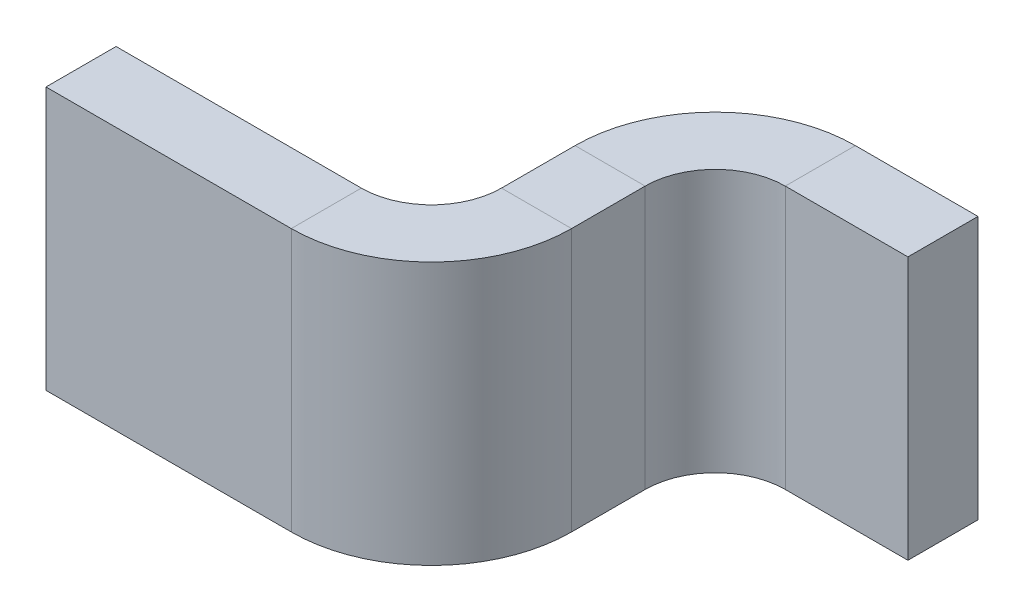
ISO-10303-21;
HEADER;
FILE_DESCRIPTION(('STEP AP214'),'2;1');
FILE_NAME('part.step','',(''),(''),'','','');
FILE_SCHEMA(('AUTOMOTIVE_DESIGN { 1 0 10303 214 1 1 1 1 }'));
ENDSEC;
DATA;
#1=APPLICATION_CONTEXT('core data for automotive mechanical design processes');
#2=APPLICATION_PROTOCOL_DEFINITION('international standard','automotive_design',2000,#1);
#3=PRODUCT_CONTEXT('',#1,'mechanical');
#4=PRODUCT('Part','Part','',(#3));
#5=PRODUCT_RELATED_PRODUCT_CATEGORY('part','',(#4));
#6=PRODUCT_DEFINITION_FORMATION('','',#4);
#7=PRODUCT_DEFINITION_CONTEXT('part definition',#1,'design');
#8=PRODUCT_DEFINITION('design','',#6,#7);
#9=PRODUCT_DEFINITION_SHAPE('','',#8);
#10=(LENGTH_UNIT() NAMED_UNIT(*) SI_UNIT(.MILLI.,.METRE.));
#11=(NAMED_UNIT(*) PLANE_ANGLE_UNIT() SI_UNIT($,.RADIAN.));
#12=(NAMED_UNIT(*) SI_UNIT($,.STERADIAN.) SOLID_ANGLE_UNIT());
#13=UNCERTAINTY_MEASURE_WITH_UNIT(LENGTH_MEASURE(1.E-05),#10,'distance_accuracy_value','');
#14=(GEOMETRIC_REPRESENTATION_CONTEXT(3) GLOBAL_UNCERTAINTY_ASSIGNED_CONTEXT((#13)) GLOBAL_UNIT_ASSIGNED_CONTEXT((#10,
#11,#12)) REPRESENTATION_CONTEXT('',''));
#15=CARTESIAN_POINT('',(0.,0.,0.));
#16=DIRECTION('',(0.,0.,1.));
#17=DIRECTION('',(1.,0.,0.));
#18=AXIS2_PLACEMENT_3D('',#15,#16,#17);
#19=CARTESIAN_POINT('',(0.,-0.375,0.81));
#20=DIRECTION('',(-1.,0.,0.));
#21=DIRECTION('',(0.,0.,-1.));
#22=AXIS2_PLACEMENT_3D('',#19,#20,#21);
#23=PLANE('',#22);
#24=DIRECTION('',(0.,0.,1.));
#25=VECTOR('',#24,1.);
#26=CARTESIAN_POINT('',(0.,-0.375,1.01));
#27=LINE('',#26,#25);
#28=CARTESIAN_POINT('',(0.,-0.375,0.81));
#29=VERTEX_POINT('',#28);
#30=CARTESIAN_POINT('',(0.,-0.375,1.01));
#31=VERTEX_POINT('',#30);
#32=EDGE_CURVE('E11',#29,#31,#27,.T.);
#33=ORIENTED_EDGE('',*,*,#32,.T.);
#34=DIRECTION('',(0.,1.,0.));
#35=VECTOR('',#34,1.);
#36=CARTESIAN_POINT('',(0.,0.375,1.01));
#37=LINE('',#36,#35);
#38=CARTESIAN_POINT('',(0.,0.375,1.01));
#39=VERTEX_POINT('',#38);
#40=EDGE_CURVE('E24',#31,#39,#37,.T.);
#41=ORIENTED_EDGE('',*,*,#40,.T.);
#42=DIRECTION('',(0.,0.,-1.));
#43=VECTOR('',#42,1.);
#44=CARTESIAN_POINT('',(0.,0.375,0.81));
#45=LINE('',#44,#43);
#46=CARTESIAN_POINT('',(0.,0.375,0.81));
#47=VERTEX_POINT('',#46);
#48=EDGE_CURVE('E217',#39,#47,#45,.T.);
#49=ORIENTED_EDGE('',*,*,#48,.T.);
#50=DIRECTION('',(0.,-1.,0.));
#51=VECTOR('',#50,1.);
#52=CARTESIAN_POINT('',(0.,-0.375,0.81));
#53=LINE('',#52,#51);
#54=EDGE_CURVE('E36',#47,#29,#53,.T.);
#55=ORIENTED_EDGE('',*,*,#54,.T.);
#56=EDGE_LOOP('',(#33,#41,#49,#55));
#57=FACE_BOUND('',#56,.T.);
#58=ADVANCED_FACE('F17',(#57),#23,.T.);
#59=CARTESIAN_POINT('',(0.,-0.375,0.81));
#60=DIRECTION('',(0.,0.,1.));
#61=DIRECTION('',(0.,-1.,0.));
#62=AXIS2_PLACEMENT_3D('',#59,#60,#61);
#63=PLANE('',#62);
#64=DIRECTION('',(0.,-1.,0.));
#65=VECTOR('',#64,1.);
#66=CARTESIAN_POINT('',(0.7,-0.375,0.81));
#67=LINE('',#66,#65);
#68=CARTESIAN_POINT('',(0.7,0.375,0.81));
#69=VERTEX_POINT('',#68);
#70=CARTESIAN_POINT('',(0.7,-0.375,0.81));
#71=VERTEX_POINT('',#70);
#72=EDGE_CURVE('E213',#69,#71,#67,.T.);
#73=ORIENTED_EDGE('',*,*,#72,.T.);
#74=DIRECTION('',(1.,0.,0.));
#75=VECTOR('',#74,1.);
#76=CARTESIAN_POINT('',(0.,-0.375,0.81));
#77=LINE('',#76,#75);
#78=EDGE_CURVE('E211',#29,#71,#77,.T.);
#79=ORIENTED_EDGE('',*,*,#78,.F.);
#80=ORIENTED_EDGE('',*,*,#54,.F.);
#81=DIRECTION('',(1.,0.,0.));
#82=VECTOR('',#81,1.);
#83=CARTESIAN_POINT('',(0.,0.375,0.81));
#84=LINE('',#83,#82);
#85=EDGE_CURVE('E209',#47,#69,#84,.T.);
#86=ORIENTED_EDGE('',*,*,#85,.T.);
#87=EDGE_LOOP('',(#73,#79,#80,#86));
#88=FACE_BOUND('',#87,.T.);
#89=ADVANCED_FACE('F228',(#88),#63,.F.);
#90=CARTESIAN_POINT('',(0.7,-0.375,0.61));
#91=DIRECTION('',(0.,1.,0.));
#92=DIRECTION('',(0.,0.,-1.));
#93=AXIS2_PLACEMENT_3D('',#90,#91,#92);
#94=CYLINDRICAL_SURFACE('',#93,0.2);
#95=DIRECTION('',(0.,1.,0.));
#96=VECTOR('',#95,1.);
#97=CARTESIAN_POINT('',(0.9,-0.375,0.61));
#98=LINE('',#97,#96);
#99=CARTESIAN_POINT('',(0.9,-0.375,0.61));
#100=VERTEX_POINT('',#99);
#101=CARTESIAN_POINT('',(0.9,0.375,0.61));
#102=VERTEX_POINT('',#101);
#103=EDGE_CURVE('E206',#100,#102,#98,.T.);
#104=ORIENTED_EDGE('',*,*,#103,.F.);
#105=CARTESIAN_POINT('',(0.7,-0.375,0.61));
#106=DIRECTION('',(0.,1.,0.));
#107=DIRECTION('',(0.,0.,-1.));
#108=AXIS2_PLACEMENT_3D('',#105,#106,#107);
#109=CIRCLE('',#108,0.2);
#110=EDGE_CURVE('E204',#71,#100,#109,.T.);
#111=ORIENTED_EDGE('',*,*,#110,.F.);
#112=ORIENTED_EDGE('',*,*,#72,.F.);
#113=CARTESIAN_POINT('',(0.7,0.375,0.61));
#114=DIRECTION('',(0.,1.,0.));
#115=DIRECTION('',(0.,0.,-1.));
#116=AXIS2_PLACEMENT_3D('',#113,#114,#115);
#117=CIRCLE('',#116,0.2);
#118=EDGE_CURVE('E202',#69,#102,#117,.T.);
#119=ORIENTED_EDGE('',*,*,#118,.T.);
#120=EDGE_LOOP('',(#104,#111,#112,#119));
#121=FACE_BOUND('',#120,.T.);
#122=ADVANCED_FACE('F234',(#121),#94,.F.);
#123=CARTESIAN_POINT('',(0.9,-0.375,0.61));
#124=DIRECTION('',(1.,0.,0.));
#125=DIRECTION('',(0.,-1.,0.));
#126=AXIS2_PLACEMENT_3D('',#123,#124,#125);
#127=PLANE('',#126);
#128=DIRECTION('',(0.,-1.,0.));
#129=VECTOR('',#128,1.);
#130=CARTESIAN_POINT('',(0.9,-0.375,0.4));
#131=LINE('',#130,#129);
#132=CARTESIAN_POINT('',(0.9,0.375,0.4));
#133=VERTEX_POINT('',#132);
#134=CARTESIAN_POINT('',(0.9,-0.375,0.4));
#135=VERTEX_POINT('',#134);
#136=EDGE_CURVE('E199',#133,#135,#131,.T.);
#137=ORIENTED_EDGE('',*,*,#136,.T.);
#138=DIRECTION('',(0.,0.,-1.));
#139=VECTOR('',#138,1.);
#140=CARTESIAN_POINT('',(0.9,-0.375,0.61));
#141=LINE('',#140,#139);
#142=EDGE_CURVE('E197',#100,#135,#141,.T.);
#143=ORIENTED_EDGE('',*,*,#142,.F.);
#144=ORIENTED_EDGE('',*,*,#103,.T.);
#145=DIRECTION('',(0.,0.,-1.));
#146=VECTOR('',#145,1.);
#147=CARTESIAN_POINT('',(0.9,0.375,0.61));
#148=LINE('',#147,#146);
#149=EDGE_CURVE('E195',#102,#133,#148,.T.);
#150=ORIENTED_EDGE('',*,*,#149,.T.);
#151=EDGE_LOOP('',(#137,#143,#144,#150));
#152=FACE_BOUND('',#151,.T.);
#153=ADVANCED_FACE('F246',(#152),#127,.F.);
#154=CARTESIAN_POINT('',(1.3,-0.375,0.4));
#155=DIRECTION('',(0.,-1.,0.));
#156=DIRECTION('',(0.,0.,-1.));
#157=AXIS2_PLACEMENT_3D('',#154,#155,#156);
#158=CYLINDRICAL_SURFACE('',#157,0.4);
#159=CARTESIAN_POINT('',(1.3,0.375,0.4));
#160=DIRECTION('',(0.,-1.,0.));
#161=DIRECTION('',(0.,0.,-1.));
#162=AXIS2_PLACEMENT_3D('',#159,#160,#161);
#163=CIRCLE('',#162,0.4);
#164=CARTESIAN_POINT('',(1.3,0.375,0.));
#165=VERTEX_POINT('',#164);
#166=EDGE_CURVE('E193',#133,#165,#163,.T.);
#167=ORIENTED_EDGE('',*,*,#166,.T.);
#168=DIRECTION('',(0.,-1.,0.));
#169=VECTOR('',#168,1.);
#170=CARTESIAN_POINT('',(1.3,-0.375,0.));
#171=LINE('',#170,#169);
#172=CARTESIAN_POINT('',(1.3,-0.375,0.));
#173=VERTEX_POINT('',#172);
#174=EDGE_CURVE('E191',#165,#173,#171,.T.);
#175=ORIENTED_EDGE('',*,*,#174,.T.);
#176=CARTESIAN_POINT('',(1.3,-0.375,0.4));
#177=DIRECTION('',(0.,-1.,0.));
#178=DIRECTION('',(0.,0.,-1.));
#179=AXIS2_PLACEMENT_3D('',#176,#177,#178);
#180=CIRCLE('',#179,0.4);
#181=EDGE_CURVE('E188',#135,#173,#180,.T.);
#182=ORIENTED_EDGE('',*,*,#181,.F.);
#183=ORIENTED_EDGE('',*,*,#136,.F.);
#184=EDGE_LOOP('',(#167,#175,#182,#183));
#185=FACE_BOUND('',#184,.T.);
#186=ADVANCED_FACE('F251',(#185),#158,.T.);
#187=CARTESIAN_POINT('',(1.3,-0.375,0.));
#188=DIRECTION('',(0.,0.,1.));
#189=DIRECTION('',(0.,-1.,0.));
#190=AXIS2_PLACEMENT_3D('',#187,#188,#189);
#191=PLANE('',#190);
#192=DIRECTION('',(0.,-1.,0.));
#193=VECTOR('',#192,1.);
#194=CARTESIAN_POINT('',(1.65,-0.375,0.));
#195=LINE('',#194,#193);
#196=CARTESIAN_POINT('',(1.65,0.375,0.));
#197=VERTEX_POINT('',#196);
#198=CARTESIAN_POINT('',(1.65,-0.375,0.));
#199=VERTEX_POINT('',#198);
#200=EDGE_CURVE('E130',#197,#199,#195,.T.);
#201=ORIENTED_EDGE('',*,*,#200,.T.);
#202=DIRECTION('',(1.,0.,0.));
#203=VECTOR('',#202,1.);
#204=CARTESIAN_POINT('',(1.3,-0.375,0.));
#205=LINE('',#204,#203);
#206=EDGE_CURVE('E185',#173,#199,#205,.T.);
#207=ORIENTED_EDGE('',*,*,#206,.F.);
#208=ORIENTED_EDGE('',*,*,#174,.F.);
#209=DIRECTION('',(1.,0.,0.));
#210=VECTOR('',#209,1.);
#211=CARTESIAN_POINT('',(1.3,0.375,0.));
#212=LINE('',#211,#210);
#213=EDGE_CURVE('E183',#165,#197,#212,.T.);
#214=ORIENTED_EDGE('',*,*,#213,.T.);
#215=EDGE_LOOP('',(#201,#207,#208,#214));
#216=FACE_BOUND('',#215,.T.);
#217=ADVANCED_FACE('F268',(#216),#191,.F.);
#218=CARTESIAN_POINT('',(0.,-0.375,1.01));
#219=DIRECTION('',(0.,1.,0.));
#220=DIRECTION('',(0.,0.,1.));
#221=AXIS2_PLACEMENT_3D('',#218,#219,#220);
#222=PLANE('',#221);
#223=DIRECTION('',(0.,0.,1.));
#224=VECTOR('',#223,1.);
#225=CARTESIAN_POINT('',(0.7,-0.375,1.01));
#226=LINE('',#225,#224);
#227=CARTESIAN_POINT('',(0.7,-0.375,1.01));
#228=VERTEX_POINT('',#227);
#229=EDGE_CURVE('E180',#71,#228,#226,.T.);
#230=ORIENTED_EDGE('',*,*,#229,.T.);
#231=DIRECTION('',(1.,0.,0.));
#232=VECTOR('',#231,1.);
#233=CARTESIAN_POINT('',(0.,-0.375,1.01));
#234=LINE('',#233,#232);
#235=EDGE_CURVE('E178',#31,#228,#234,.T.);
#236=ORIENTED_EDGE('',*,*,#235,.F.);
#237=ORIENTED_EDGE('',*,*,#32,.F.);
#238=ORIENTED_EDGE('',*,*,#78,.T.);
#239=EDGE_LOOP('',(#230,#236,#237,#238));
#240=FACE_BOUND('',#239,.T.);
#241=ADVANCED_FACE('F306',(#240),#222,.F.);
#242=CARTESIAN_POINT('',(0.912132034356,-0.375,0.822132034356));
#243=DIRECTION('',(0.,-1.,0.));
#244=DIRECTION('',(0.707106781186548,0.,-0.707106781186548));
#245=AXIS2_PLACEMENT_3D('',#242,#243,#244);
#246=PLANE('',#245);
#247=ORIENTED_EDGE('',*,*,#110,.T.);
#248=DIRECTION('',(1.,0.,0.));
#249=VECTOR('',#248,1.);
#250=CARTESIAN_POINT('',(1.1,-0.375,0.61));
#251=LINE('',#250,#249);
#252=CARTESIAN_POINT('',(1.1,-0.375,0.61));
#253=VERTEX_POINT('',#252);
#254=EDGE_CURVE('E176',#100,#253,#251,.T.);
#255=ORIENTED_EDGE('',*,*,#254,.T.);
#256=CARTESIAN_POINT('',(0.7,-0.375,0.61));
#257=DIRECTION('',(0.,1.,0.));
#258=DIRECTION('',(0.,0.,-1.));
#259=AXIS2_PLACEMENT_3D('',#256,#257,#258);
#260=CIRCLE('',#259,0.4);
#261=EDGE_CURVE('E173',#228,#253,#260,.T.);
#262=ORIENTED_EDGE('',*,*,#261,.F.);
#263=ORIENTED_EDGE('',*,*,#229,.F.);
#264=EDGE_LOOP('',(#247,#255,#262,#263));
#265=FACE_BOUND('',#264,.T.);
#266=ADVANCED_FACE('F277',(#265),#246,.T.);
#267=CARTESIAN_POINT('',(1.1,-0.375,0.61));
#268=DIRECTION('',(0.,1.,0.));
#269=DIRECTION('',(1.,0.,0.));
#270=AXIS2_PLACEMENT_3D('',#267,#268,#269);
#271=PLANE('',#270);
#272=DIRECTION('',(1.,0.,0.));
#273=VECTOR('',#272,1.);
#274=CARTESIAN_POINT('',(1.1,-0.375,0.4));
#275=LINE('',#274,#273);
#276=CARTESIAN_POINT('',(1.1,-0.375,0.4));
#277=VERTEX_POINT('',#276);
#278=EDGE_CURVE('E170',#135,#277,#275,.T.);
#279=ORIENTED_EDGE('',*,*,#278,.T.);
#280=DIRECTION('',(0.,0.,-1.));
#281=VECTOR('',#280,1.);
#282=CARTESIAN_POINT('',(1.1,-0.375,0.61));
#283=LINE('',#282,#281);
#284=EDGE_CURVE('E168',#253,#277,#283,.T.);
#285=ORIENTED_EDGE('',*,*,#284,.F.);
#286=ORIENTED_EDGE('',*,*,#254,.F.);
#287=ORIENTED_EDGE('',*,*,#142,.T.);
#288=EDGE_LOOP('',(#279,#285,#286,#287));
#289=FACE_BOUND('',#288,.T.);
#290=ADVANCED_FACE('F272',(#289),#271,.F.);
#291=CARTESIAN_POINT('',(1.087867965644,-0.375,0.187867965644));
#292=DIRECTION('',(0.,-1.,0.));
#293=DIRECTION('',(0.707106781186548,0.,-0.707106781186548));
#294=AXIS2_PLACEMENT_3D('',#291,#292,#293);
#295=PLANE('',#294);
#296=ORIENTED_EDGE('',*,*,#181,.T.);
#297=DIRECTION('',(0.,0.,1.));
#298=VECTOR('',#297,1.);
#299=CARTESIAN_POINT('',(1.3,-0.375,0.2));
#300=LINE('',#299,#298);
#301=CARTESIAN_POINT('',(1.3,-0.375,0.2));
#302=VERTEX_POINT('',#301);
#303=EDGE_CURVE('E166',#173,#302,#300,.T.);
#304=ORIENTED_EDGE('',*,*,#303,.T.);
#305=CARTESIAN_POINT('',(1.3,-0.375,0.4));
#306=DIRECTION('',(0.,-1.,0.));
#307=DIRECTION('',(0.,0.,-1.));
#308=AXIS2_PLACEMENT_3D('',#305,#306,#307);
#309=CIRCLE('',#308,0.2);
#310=EDGE_CURVE('E163',#277,#302,#309,.T.);
#311=ORIENTED_EDGE('',*,*,#310,.F.);
#312=ORIENTED_EDGE('',*,*,#278,.F.);
#313=EDGE_LOOP('',(#296,#304,#311,#312));
#314=FACE_BOUND('',#313,.T.);
#315=ADVANCED_FACE('F269',(#314),#295,.T.);
#316=CARTESIAN_POINT('',(1.3,-0.375,0.2));
#317=DIRECTION('',(0.,1.,0.));
#318=DIRECTION('',(0.,0.,1.));
#319=AXIS2_PLACEMENT_3D('',#316,#317,#318);
#320=PLANE('',#319);
#321=DIRECTION('',(0.,0.,1.));
#322=VECTOR('',#321,1.);
#323=CARTESIAN_POINT('',(1.65,-0.375,0.2));
#324=LINE('',#323,#322);
#325=CARTESIAN_POINT('',(1.65,-0.375,0.2));
#326=VERTEX_POINT('',#325);
#327=EDGE_CURVE('E161',#199,#326,#324,.T.);
#328=ORIENTED_EDGE('',*,*,#327,.T.);
#329=DIRECTION('',(1.,0.,0.));
#330=VECTOR('',#329,1.);
#331=CARTESIAN_POINT('',(1.3,-0.375,0.2));
#332=LINE('',#331,#330);
#333=EDGE_CURVE('E121',#302,#326,#332,.T.);
#334=ORIENTED_EDGE('',*,*,#333,.F.);
#335=ORIENTED_EDGE('',*,*,#303,.F.);
#336=ORIENTED_EDGE('',*,*,#206,.T.);
#337=EDGE_LOOP('',(#328,#334,#335,#336));
#338=FACE_BOUND('',#337,.T.);
#339=ADVANCED_FACE('F265',(#338),#320,.F.);
#340=CARTESIAN_POINT('',(0.,0.375,1.01));
#341=DIRECTION('',(0.,0.,-1.));
#342=DIRECTION('',(0.,1.,0.));
#343=AXIS2_PLACEMENT_3D('',#340,#341,#342);
#344=PLANE('',#343);
#345=DIRECTION('',(0.,1.,0.));
#346=VECTOR('',#345,1.);
#347=CARTESIAN_POINT('',(0.7,0.375,1.01));
#348=LINE('',#347,#346);
#349=CARTESIAN_POINT('',(0.7,0.375,1.01));
#350=VERTEX_POINT('',#349);
#351=EDGE_CURVE('E157',#228,#350,#348,.T.);
#352=ORIENTED_EDGE('',*,*,#351,.T.);
#353=DIRECTION('',(1.,0.,0.));
#354=VECTOR('',#353,1.);
#355=CARTESIAN_POINT('',(0.,0.375,1.01));
#356=LINE('',#355,#354);
#357=EDGE_CURVE('E155',#39,#350,#356,.T.);
#358=ORIENTED_EDGE('',*,*,#357,.F.);
#359=ORIENTED_EDGE('',*,*,#40,.F.);
#360=ORIENTED_EDGE('',*,*,#235,.T.);
#361=EDGE_LOOP('',(#352,#358,#359,#360));
#362=FACE_BOUND('',#361,.T.);
#363=ADVANCED_FACE('F220',(#362),#344,.F.);
#364=CARTESIAN_POINT('',(0.7,0.375,0.61));
#365=DIRECTION('',(0.,1.,0.));
#366=DIRECTION('',(0.,0.,-1.));
#367=AXIS2_PLACEMENT_3D('',#364,#365,#366);
#368=CYLINDRICAL_SURFACE('',#367,0.4);
#369=ORIENTED_EDGE('',*,*,#261,.T.);
#370=DIRECTION('',(0.,1.,0.));
#371=VECTOR('',#370,1.);
#372=CARTESIAN_POINT('',(1.1,0.375,0.61));
#373=LINE('',#372,#371);
#374=CARTESIAN_POINT('',(1.1,0.375,0.61));
#375=VERTEX_POINT('',#374);
#376=EDGE_CURVE('E153',#253,#375,#373,.T.);
#377=ORIENTED_EDGE('',*,*,#376,.T.);
#378=CARTESIAN_POINT('',(0.7,0.375,0.61));
#379=DIRECTION('',(0.,1.,0.));
#380=DIRECTION('',(0.,0.,-1.));
#381=AXIS2_PLACEMENT_3D('',#378,#379,#380);
#382=CIRCLE('',#381,0.4);
#383=EDGE_CURVE('E150',#350,#375,#382,.T.);
#384=ORIENTED_EDGE('',*,*,#383,.F.);
#385=ORIENTED_EDGE('',*,*,#351,.F.);
#386=EDGE_LOOP('',(#369,#377,#384,#385));
#387=FACE_BOUND('',#386,.T.);
#388=ADVANCED_FACE('F279',(#387),#368,.T.);
#389=CARTESIAN_POINT('',(1.1,0.375,0.61));
#390=DIRECTION('',(-1.,0.,0.));
#391=DIRECTION('',(0.,1.,0.));
#392=AXIS2_PLACEMENT_3D('',#389,#390,#391);
#393=PLANE('',#392);
#394=DIRECTION('',(0.,1.,0.));
#395=VECTOR('',#394,1.);
#396=CARTESIAN_POINT('',(1.1,0.375,0.4));
#397=LINE('',#396,#395);
#398=CARTESIAN_POINT('',(1.1,0.375,0.4));
#399=VERTEX_POINT('',#398);
#400=EDGE_CURVE('E147',#277,#399,#397,.T.);
#401=ORIENTED_EDGE('',*,*,#400,.T.);
#402=DIRECTION('',(0.,0.,-1.));
#403=VECTOR('',#402,1.);
#404=CARTESIAN_POINT('',(1.1,0.375,0.61));
#405=LINE('',#404,#403);
#406=EDGE_CURVE('E145',#375,#399,#405,.T.);
#407=ORIENTED_EDGE('',*,*,#406,.F.);
#408=ORIENTED_EDGE('',*,*,#376,.F.);
#409=ORIENTED_EDGE('',*,*,#284,.T.);
#410=EDGE_LOOP('',(#401,#407,#408,#409));
#411=FACE_BOUND('',#410,.T.);
#412=ADVANCED_FACE('F281',(#411),#393,.F.);
#413=CARTESIAN_POINT('',(1.3,0.375,0.4));
#414=DIRECTION('',(0.,-1.,0.));
#415=DIRECTION('',(0.,0.,-1.));
#416=AXIS2_PLACEMENT_3D('',#413,#414,#415);
#417=CYLINDRICAL_SURFACE('',#416,0.2);
#418=DIRECTION('',(0.,-1.,0.));
#419=VECTOR('',#418,1.);
#420=CARTESIAN_POINT('',(1.3,0.375,0.2));
#421=LINE('',#420,#419);
#422=CARTESIAN_POINT('',(1.3,0.375,0.2));
#423=VERTEX_POINT('',#422);
#424=EDGE_CURVE('E143',#423,#302,#421,.T.);
#425=ORIENTED_EDGE('',*,*,#424,.F.);
#426=CARTESIAN_POINT('',(1.3,0.375,0.4));
#427=DIRECTION('',(0.,-1.,0.));
#428=DIRECTION('',(0.,0.,-1.));
#429=AXIS2_PLACEMENT_3D('',#426,#427,#428);
#430=CIRCLE('',#429,0.2);
#431=EDGE_CURVE('E125',#399,#423,#430,.T.);
#432=ORIENTED_EDGE('',*,*,#431,.F.);
#433=ORIENTED_EDGE('',*,*,#400,.F.);
#434=ORIENTED_EDGE('',*,*,#310,.T.);
#435=EDGE_LOOP('',(#425,#432,#433,#434));
#436=FACE_BOUND('',#435,.T.);
#437=ADVANCED_FACE('F260',(#436),#417,.F.);
#438=CARTESIAN_POINT('',(1.3,0.375,0.2));
#439=DIRECTION('',(0.,0.,-1.));
#440=DIRECTION('',(0.,1.,0.));
#441=AXIS2_PLACEMENT_3D('',#438,#439,#440);
#442=PLANE('',#441);
#443=DIRECTION('',(0.,1.,0.));
#444=VECTOR('',#443,1.);
#445=CARTESIAN_POINT('',(1.65,0.375,0.2));
#446=LINE('',#445,#444);
#447=CARTESIAN_POINT('',(1.65,0.375,0.2));
#448=VERTEX_POINT('',#447);
#449=EDGE_CURVE('E115',#326,#448,#446,.T.);
#450=ORIENTED_EDGE('',*,*,#449,.T.);
#451=DIRECTION('',(1.,0.,0.));
#452=VECTOR('',#451,1.);
#453=CARTESIAN_POINT('',(1.3,0.375,0.2));
#454=LINE('',#453,#452);
#455=EDGE_CURVE('E105',#423,#448,#454,.T.);
#456=ORIENTED_EDGE('',*,*,#455,.F.);
#457=ORIENTED_EDGE('',*,*,#424,.T.);
#458=ORIENTED_EDGE('',*,*,#333,.T.);
#459=EDGE_LOOP('',(#450,#456,#457,#458));
#460=FACE_BOUND('',#459,.T.);
#461=ADVANCED_FACE('F119',(#460),#442,.F.);
#462=CARTESIAN_POINT('',(0.,0.375,0.81));
#463=DIRECTION('',(0.,-1.,0.));
#464=DIRECTION('',(0.,0.,-1.));
#465=AXIS2_PLACEMENT_3D('',#462,#463,#464);
#466=PLANE('',#465);
#467=DIRECTION('',(0.,0.,-1.));
#468=VECTOR('',#467,1.);
#469=CARTESIAN_POINT('',(0.7,0.375,0.81));
#470=LINE('',#469,#468);
#471=EDGE_CURVE('E116',#350,#69,#470,.T.);
#472=ORIENTED_EDGE('',*,*,#471,.T.);
#473=ORIENTED_EDGE('',*,*,#85,.F.);
#474=ORIENTED_EDGE('',*,*,#48,.F.);
#475=ORIENTED_EDGE('',*,*,#357,.T.);
#476=EDGE_LOOP('',(#472,#473,#474,#475));
#477=FACE_BOUND('',#476,.T.);
#478=ADVANCED_FACE('F224',(#477),#466,.F.);
#479=CARTESIAN_POINT('',(0.912132034356,0.375,0.822132034356));
#480=DIRECTION('',(0.,1.,0.));
#481=DIRECTION('',(0.707106781186548,0.,-0.707106781186548));
#482=AXIS2_PLACEMENT_3D('',#479,#480,#481);
#483=PLANE('',#482);
#484=ORIENTED_EDGE('',*,*,#383,.T.);
#485=DIRECTION('',(-1.,0.,0.));
#486=VECTOR('',#485,1.);
#487=CARTESIAN_POINT('',(0.9,0.375,0.61));
#488=LINE('',#487,#486);
#489=EDGE_CURVE('E137',#375,#102,#488,.T.);
#490=ORIENTED_EDGE('',*,*,#489,.T.);
#491=ORIENTED_EDGE('',*,*,#118,.F.);
#492=ORIENTED_EDGE('',*,*,#471,.F.);
#493=EDGE_LOOP('',(#484,#490,#491,#492));
#494=FACE_BOUND('',#493,.T.);
#495=ADVANCED_FACE('F237',(#494),#483,.T.);
#496=CARTESIAN_POINT('',(0.9,0.375,0.61));
#497=DIRECTION('',(0.,-1.,0.));
#498=DIRECTION('',(-1.,0.,0.));
#499=AXIS2_PLACEMENT_3D('',#496,#497,#498);
#500=PLANE('',#499);
#501=DIRECTION('',(-1.,0.,0.));
#502=VECTOR('',#501,1.);
#503=CARTESIAN_POINT('',(0.9,0.375,0.4));
#504=LINE('',#503,#502);
#505=EDGE_CURVE('E132',#399,#133,#504,.T.);
#506=ORIENTED_EDGE('',*,*,#505,.T.);
#507=ORIENTED_EDGE('',*,*,#149,.F.);
#508=ORIENTED_EDGE('',*,*,#489,.F.);
#509=ORIENTED_EDGE('',*,*,#406,.T.);
#510=EDGE_LOOP('',(#506,#507,#508,#509));
#511=FACE_BOUND('',#510,.T.);
#512=ADVANCED_FACE('F242',(#511),#500,.F.);
#513=CARTESIAN_POINT('',(1.087867965644,0.375,0.187867965644));
#514=DIRECTION('',(0.,1.,0.));
#515=DIRECTION('',(0.707106781186548,0.,-0.707106781186548));
#516=AXIS2_PLACEMENT_3D('',#513,#514,#515);
#517=PLANE('',#516);
#518=ORIENTED_EDGE('',*,*,#431,.T.);
#519=DIRECTION('',(0.,0.,-1.));
#520=VECTOR('',#519,1.);
#521=CARTESIAN_POINT('',(1.3,0.375,0.));
#522=LINE('',#521,#520);
#523=EDGE_CURVE('E112',#423,#165,#522,.T.);
#524=ORIENTED_EDGE('',*,*,#523,.T.);
#525=ORIENTED_EDGE('',*,*,#166,.F.);
#526=ORIENTED_EDGE('',*,*,#505,.F.);
#527=EDGE_LOOP('',(#518,#524,#525,#526));
#528=FACE_BOUND('',#527,.T.);
#529=ADVANCED_FACE('F255',(#528),#517,.T.);
#530=CARTESIAN_POINT('',(1.3,0.375,0.));
#531=DIRECTION('',(0.,-1.,0.));
#532=DIRECTION('',(0.,0.,-1.));
#533=AXIS2_PLACEMENT_3D('',#530,#531,#532);
#534=PLANE('',#533);
#535=DIRECTION('',(0.,0.,-1.));
#536=VECTOR('',#535,1.);
#537=CARTESIAN_POINT('',(1.65,0.375,0.));
#538=LINE('',#537,#536);
#539=EDGE_CURVE('E110',#448,#197,#538,.T.);
#540=ORIENTED_EDGE('',*,*,#539,.T.);
#541=ORIENTED_EDGE('',*,*,#213,.F.);
#542=ORIENTED_EDGE('',*,*,#523,.F.);
#543=ORIENTED_EDGE('',*,*,#455,.T.);
#544=EDGE_LOOP('',(#540,#541,#542,#543));
#545=FACE_BOUND('',#544,.T.);
#546=ADVANCED_FACE('F107',(#545),#534,.F.);
#547=CARTESIAN_POINT('',(1.65,-0.375,0.));
#548=DIRECTION('',(-1.,0.,0.));
#549=DIRECTION('',(0.,0.,-1.));
#550=AXIS2_PLACEMENT_3D('',#547,#548,#549);
#551=PLANE('',#550);
#552=ORIENTED_EDGE('',*,*,#200,.F.);
#553=ORIENTED_EDGE('',*,*,#539,.F.);
#554=ORIENTED_EDGE('',*,*,#449,.F.);
#555=ORIENTED_EDGE('',*,*,#327,.F.);
#556=EDGE_LOOP('',(#552,#553,#554,#555));
#557=FACE_BOUND('',#556,.T.);
#558=ADVANCED_FACE('F128',(#557),#551,.F.);
#559=CLOSED_SHELL('',(#58,#89,#122,#153,#186,#217,#241,#266,#290,#315,#339,#363,#388,#412,#437,
#461,#478,#495,#512,#529,#546,#558));
#560=MANIFOLD_SOLID_BREP('B1',#559);
#561=ADVANCED_BREP_SHAPE_REPRESENTATION('',(#18,#560),#14);
#562=SHAPE_DEFINITION_REPRESENTATION(#9,#561);
ENDSEC;
END-ISO-10303-21;
